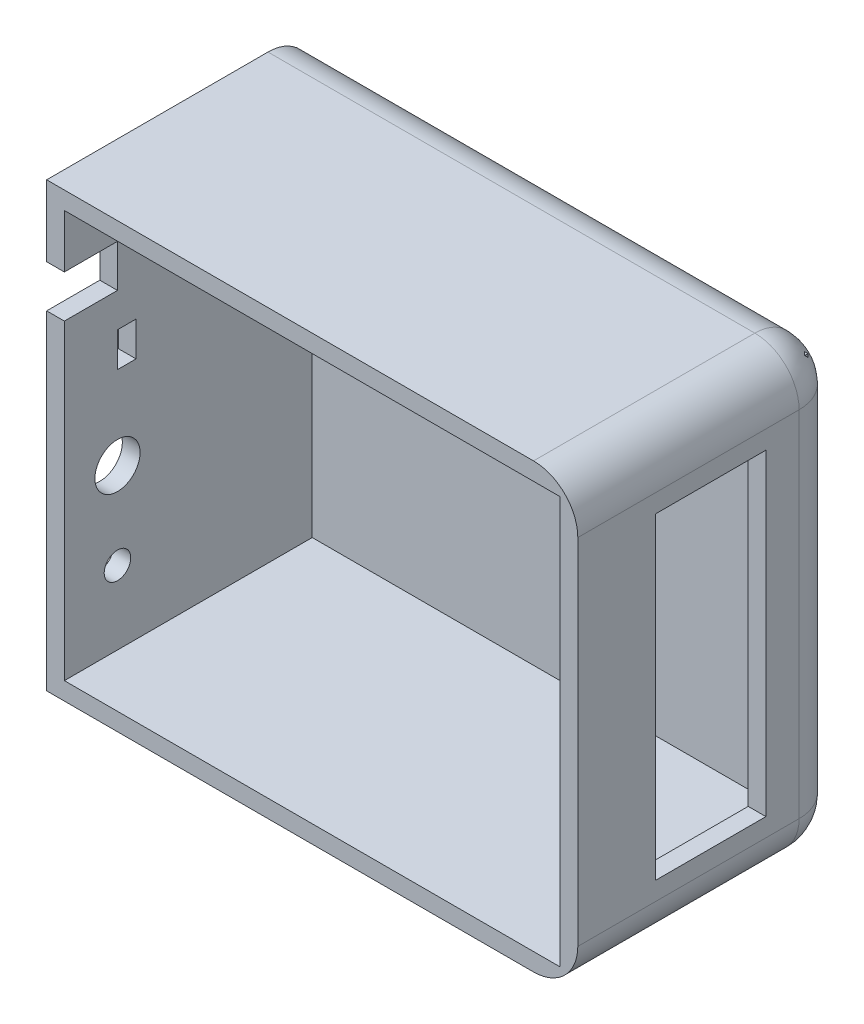
ISO-10303-21;
HEADER;
FILE_DESCRIPTION(('STEP AP214'),'2;1');
FILE_NAME('part.step','',(''),(''),'','','');
FILE_SCHEMA(('AUTOMOTIVE_DESIGN { 1 0 10303 214 1 1 1 1 }'));
ENDSEC;
DATA;
#1=APPLICATION_CONTEXT('core data for automotive mechanical design processes');
#2=APPLICATION_PROTOCOL_DEFINITION('international standard','automotive_design',2000,#1);
#3=PRODUCT_CONTEXT('',#1,'mechanical');
#4=PRODUCT('Part','Part','',(#3));
#5=PRODUCT_RELATED_PRODUCT_CATEGORY('part','',(#4));
#6=PRODUCT_DEFINITION_FORMATION('','',#4);
#7=PRODUCT_DEFINITION_CONTEXT('part definition',#1,'design');
#8=PRODUCT_DEFINITION('design','',#6,#7);
#9=PRODUCT_DEFINITION_SHAPE('','',#8);
#10=(LENGTH_UNIT() NAMED_UNIT(*) SI_UNIT(.MILLI.,.METRE.));
#11=(NAMED_UNIT(*) PLANE_ANGLE_UNIT() SI_UNIT($,.RADIAN.));
#12=(NAMED_UNIT(*) SI_UNIT($,.STERADIAN.) SOLID_ANGLE_UNIT());
#13=UNCERTAINTY_MEASURE_WITH_UNIT(LENGTH_MEASURE(1.E-05),#10,'distance_accuracy_value','');
#14=(GEOMETRIC_REPRESENTATION_CONTEXT(3) GLOBAL_UNCERTAINTY_ASSIGNED_CONTEXT((#13)) GLOBAL_UNIT_ASSIGNED_CONTEXT((#10,
#11,#12)) REPRESENTATION_CONTEXT('',''));
#15=CARTESIAN_POINT('',(0.,0.,0.));
#16=DIRECTION('',(0.,0.,1.));
#17=DIRECTION('',(1.,0.,0.));
#18=AXIS2_PLACEMENT_3D('',#15,#16,#17);
#19=CARTESIAN_POINT('',(0.,0.,4.));
#20=DIRECTION('',(1.,0.,0.));
#21=DIRECTION('',(0.,0.,-1.));
#22=AXIS2_PLACEMENT_3D('',#19,#20,#21);
#23=PLANE('',#22);
#24=CARTESIAN_POINT('',(0.,40.0941932592972,48.));
#25=DIRECTION('',(1.,0.,0.));
#26=DIRECTION('',(0.,0.,-1.));
#27=AXIS2_PLACEMENT_3D('',#24,#25,#26);
#28=CIRCLE('',#27,5.1);
#29=CARTESIAN_POINT('',(0.,40.0941932592972,42.9));
#30=VERTEX_POINT('',#29);
#31=EDGE_CURVE('E225',#30,#30,#28,.F.);
#32=ORIENTED_EDGE('',*,*,#31,.F.);
#33=EDGE_LOOP('',(#32));
#34=FACE_BOUND('',#33,.T.);
#35=DIRECTION('',(0.,1.,0.));
#36=VECTOR('',#35,1.);
#37=CARTESIAN_POINT('',(0.,0.,48.));
#38=LINE('',#37,#36);
#39=CARTESIAN_POINT('',(0.,74.357923225923,48.));
#40=VERTEX_POINT('',#39);
#41=CARTESIAN_POINT('',(0.,83.9579232259231,48.));
#42=VERTEX_POINT('',#41);
#43=EDGE_CURVE('E285',#40,#42,#38,.T.);
#44=ORIENTED_EDGE('',*,*,#43,.T.);
#45=DIRECTION('',(0.,0.,1.));
#46=VECTOR('',#45,1.);
#47=CARTESIAN_POINT('',(0.,83.9579232259231,4.));
#48=LINE('',#47,#46);
#49=CARTESIAN_POINT('',(0.,83.9579232259231,60.));
#50=VERTEX_POINT('',#49);
#51=EDGE_CURVE('E282',#42,#50,#48,.T.);
#52=ORIENTED_EDGE('',*,*,#51,.T.);
#53=DIRECTION('',(0.,-1.,0.));
#54=VECTOR('',#53,1.);
#55=CARTESIAN_POINT('',(0.,0.,60.));
#56=LINE('',#55,#54);
#57=CARTESIAN_POINT('',(0.,100.,60.));
#58=VERTEX_POINT('',#57);
#59=EDGE_CURVE('E326',#58,#50,#56,.T.);
#60=ORIENTED_EDGE('',*,*,#59,.F.);
#61=DIRECTION('',(0.,0.,-1.));
#62=VECTOR('',#61,1.);
#63=CARTESIAN_POINT('',(0.,100.,4.));
#64=LINE('',#63,#62);
#65=CARTESIAN_POINT('',(0.,100.,10.));
#66=VERTEX_POINT('',#65);
#67=EDGE_CURVE('E365',#58,#66,#64,.T.);
#68=ORIENTED_EDGE('',*,*,#67,.T.);
#69=CARTESIAN_POINT('',(0.,90.,10.));
#70=DIRECTION('',(1.,0.,0.));
#71=DIRECTION('',(0.,0.,-1.));
#72=AXIS2_PLACEMENT_3D('',#69,#70,#71);
#73=CIRCLE('',#72,10.);
#74=CARTESIAN_POINT('',(0.,90.,0.));
#75=VERTEX_POINT('',#74);
#76=EDGE_CURVE('E419',#66,#75,#73,.F.);
#77=ORIENTED_EDGE('',*,*,#76,.T.);
#78=DIRECTION('',(0.,-1.,0.));
#79=VECTOR('',#78,1.);
#80=CARTESIAN_POINT('',(0.,0.,0.));
#81=LINE('',#80,#79);
#82=CARTESIAN_POINT('',(0.,10.,0.));
#83=VERTEX_POINT('',#82);
#84=EDGE_CURVE('E363',#75,#83,#81,.T.);
#85=ORIENTED_EDGE('',*,*,#84,.T.);
#86=CARTESIAN_POINT('',(0.,10.,10.));
#87=DIRECTION('',(1.,0.,0.));
#88=DIRECTION('',(0.,0.,-1.));
#89=AXIS2_PLACEMENT_3D('',#86,#87,#88);
#90=CIRCLE('',#89,10.);
#91=CARTESIAN_POINT('',(0.,0.,10.));
#92=VERTEX_POINT('',#91);
#93=EDGE_CURVE('E401',#83,#92,#90,.F.);
#94=ORIENTED_EDGE('',*,*,#93,.T.);
#95=DIRECTION('',(0.,0.,-1.));
#96=VECTOR('',#95,1.);
#97=CARTESIAN_POINT('',(0.,0.,4.));
#98=LINE('',#97,#96);
#99=CARTESIAN_POINT('',(0.,0.,60.));
#100=VERTEX_POINT('',#99);
#101=EDGE_CURVE('E368',#100,#92,#98,.T.);
#102=ORIENTED_EDGE('',*,*,#101,.F.);
#103=CARTESIAN_POINT('',(0.,74.357923225923,60.));
#104=VERTEX_POINT('',#103);
#105=EDGE_CURVE('E325',#104,#100,#56,.T.);
#106=ORIENTED_EDGE('',*,*,#105,.F.);
#107=DIRECTION('',(0.,0.,1.));
#108=VECTOR('',#107,1.);
#109=CARTESIAN_POINT('',(0.,74.357923225923,4.));
#110=LINE('',#109,#108);
#111=EDGE_CURVE('E278',#40,#104,#110,.T.);
#112=ORIENTED_EDGE('',*,*,#111,.F.);
#113=EDGE_LOOP('',(#44,#52,#60,#68,#77,#85,#94,#102,#106,#112));
#114=FACE_BOUND('',#113,.T.);
#115=DIRECTION('',(0.,1.,0.));
#116=VECTOR('',#115,1.);
#117=CARTESIAN_POINT('',(0.,0.,48.));
#118=LINE('',#117,#116);
#119=CARTESIAN_POINT('',(0.,58.8579232259231,48.));
#120=VERTEX_POINT('',#119);
#121=CARTESIAN_POINT('',(0.,66.6579232259231,48.));
#122=VERTEX_POINT('',#121);
#123=EDGE_CURVE('E262',#120,#122,#118,.T.);
#124=ORIENTED_EDGE('',*,*,#123,.F.);
#125=DIRECTION('',(0.,0.,1.));
#126=VECTOR('',#125,1.);
#127=CARTESIAN_POINT('',(0.,58.8579232259231,4.));
#128=LINE('',#127,#126);
#129=CARTESIAN_POINT('',(0.,58.8579232259231,43.8));
#130=VERTEX_POINT('',#129);
#131=EDGE_CURVE('E248',#130,#120,#128,.T.);
#132=ORIENTED_EDGE('',*,*,#131,.F.);
#133=DIRECTION('',(0.,1.,0.));
#134=VECTOR('',#133,1.);
#135=CARTESIAN_POINT('',(0.,0.,43.8));
#136=LINE('',#135,#134);
#137=CARTESIAN_POINT('',(0.,66.6579232259231,43.8));
#138=VERTEX_POINT('',#137);
#139=EDGE_CURVE('E216',#130,#138,#136,.T.);
#140=ORIENTED_EDGE('',*,*,#139,.T.);
#141=DIRECTION('',(0.,0.,1.));
#142=VECTOR('',#141,1.);
#143=CARTESIAN_POINT('',(0.,66.6579232259231,4.));
#144=LINE('',#143,#142);
#145=EDGE_CURVE('E214',#138,#122,#144,.T.);
#146=ORIENTED_EDGE('',*,*,#145,.T.);
#147=EDGE_LOOP('',(#124,#132,#140,#146));
#148=FACE_BOUND('',#147,.T.);
#149=CARTESIAN_POINT('',(0.,20.5603193344936,48.));
#150=DIRECTION('',(1.,0.,0.));
#151=DIRECTION('',(0.,0.,-1.));
#152=AXIS2_PLACEMENT_3D('',#149,#150,#151);
#153=CIRCLE('',#152,3.);
#154=CARTESIAN_POINT('',(0.,20.5603193344936,45.));
#155=VERTEX_POINT('',#154);
#156=EDGE_CURVE('E226',#155,#155,#153,.F.);
#157=ORIENTED_EDGE('',*,*,#156,.F.);
#158=EDGE_LOOP('',(#157));
#159=FACE_BOUND('',#158,.T.);
#160=ADVANCED_FACE('F41',(#34,#114,#148,#159),#23,.F.);
#161=CARTESIAN_POINT('',(4.00000000000001,0.,60.));
#162=DIRECTION('',(1.,0.,0.));
#163=DIRECTION('',(0.,1.,0.));
#164=AXIS2_PLACEMENT_3D('',#161,#162,#163);
#165=PLANE('',#164);
#166=CARTESIAN_POINT('',(4.00000000000001,40.0941932592972,48.));
#167=DIRECTION('',(1.,0.,0.));
#168=DIRECTION('',(0.,1.,0.));
#169=AXIS2_PLACEMENT_3D('',#166,#167,#168);
#170=CIRCLE('',#169,5.1);
#171=CARTESIAN_POINT('',(4.00000000000001,45.1941932592972,48.));
#172=VERTEX_POINT('',#171);
#173=EDGE_CURVE('E223',#172,#172,#170,.F.);
#174=ORIENTED_EDGE('',*,*,#173,.T.);
#175=EDGE_LOOP('',(#174));
#176=FACE_BOUND('',#175,.T.);
#177=DIRECTION('',(0.,0.,1.));
#178=VECTOR('',#177,1.);
#179=CARTESIAN_POINT('',(4.,83.9579232259231,60.));
#180=LINE('',#179,#178);
#181=CARTESIAN_POINT('',(4.,83.9579232259231,48.));
#182=VERTEX_POINT('',#181);
#183=CARTESIAN_POINT('',(4.00000000000001,83.9579232259231,60.));
#184=VERTEX_POINT('',#183);
#185=EDGE_CURVE('E279',#182,#184,#180,.T.);
#186=ORIENTED_EDGE('',*,*,#185,.F.);
#187=DIRECTION('',(0.,1.,0.));
#188=VECTOR('',#187,1.);
#189=CARTESIAN_POINT('',(4.00000000000001,0.,48.));
#190=LINE('',#189,#188);
#191=CARTESIAN_POINT('',(4.,74.357923225923,48.));
#192=VERTEX_POINT('',#191);
#193=EDGE_CURVE('E207',#192,#182,#190,.T.);
#194=ORIENTED_EDGE('',*,*,#193,.F.);
#195=DIRECTION('',(0.,0.,1.));
#196=VECTOR('',#195,1.);
#197=CARTESIAN_POINT('',(4.,74.357923225923,60.));
#198=LINE('',#197,#196);
#199=CARTESIAN_POINT('',(4.00000000000001,74.357923225923,60.));
#200=VERTEX_POINT('',#199);
#201=EDGE_CURVE('E275',#192,#200,#198,.T.);
#202=ORIENTED_EDGE('',*,*,#201,.T.);
#203=DIRECTION('',(0.,-1.,0.));
#204=VECTOR('',#203,1.);
#205=CARTESIAN_POINT('',(4.00000000000001,0.,60.));
#206=LINE('',#205,#204);
#207=CARTESIAN_POINT('',(4.00000000000001,3.99999999999999,60.));
#208=VERTEX_POINT('',#207);
#209=EDGE_CURVE('E329',#200,#208,#206,.T.);
#210=ORIENTED_EDGE('',*,*,#209,.T.);
#211=DIRECTION('',(0.,0.,-1.));
#212=VECTOR('',#211,1.);
#213=CARTESIAN_POINT('',(4.00000000000001,3.99999999999999,60.));
#214=LINE('',#213,#212);
#215=CARTESIAN_POINT('',(4.00000000000001,3.99999999999999,4.));
#216=VERTEX_POINT('',#215);
#217=EDGE_CURVE('E341',#208,#216,#214,.T.);
#218=ORIENTED_EDGE('',*,*,#217,.T.);
#219=DIRECTION('',(0.,-1.,0.));
#220=VECTOR('',#219,1.);
#221=CARTESIAN_POINT('',(4.00000000000001,0.,4.));
#222=LINE('',#221,#220);
#223=CARTESIAN_POINT('',(4.,96.,4.));
#224=VERTEX_POINT('',#223);
#225=EDGE_CURVE('E360',#224,#216,#222,.T.);
#226=ORIENTED_EDGE('',*,*,#225,.F.);
#227=DIRECTION('',(0.,0.,-1.));
#228=VECTOR('',#227,1.);
#229=CARTESIAN_POINT('',(4.,96.,60.));
#230=LINE('',#229,#228);
#231=CARTESIAN_POINT('',(4.,96.,60.));
#232=VERTEX_POINT('',#231);
#233=EDGE_CURVE('E349',#232,#224,#230,.T.);
#234=ORIENTED_EDGE('',*,*,#233,.F.);
#235=EDGE_CURVE('E330',#232,#184,#206,.T.);
#236=ORIENTED_EDGE('',*,*,#235,.T.);
#237=EDGE_LOOP('',(#186,#194,#202,#210,#218,#226,#234,#236));
#238=FACE_BOUND('',#237,.T.);
#239=DIRECTION('',(0.,0.,1.));
#240=VECTOR('',#239,1.);
#241=CARTESIAN_POINT('',(4.00000000000001,58.8579232259231,60.));
#242=LINE('',#241,#240);
#243=CARTESIAN_POINT('',(4.00000000000001,58.8579232259231,43.8));
#244=VERTEX_POINT('',#243);
#245=CARTESIAN_POINT('',(4.00000000000001,58.8579232259231,48.));
#246=VERTEX_POINT('',#245);
#247=EDGE_CURVE('E50',#244,#246,#242,.T.);
#248=ORIENTED_EDGE('',*,*,#247,.T.);
#249=DIRECTION('',(0.,1.,0.));
#250=VECTOR('',#249,1.);
#251=CARTESIAN_POINT('',(4.00000000000001,0.,48.));
#252=LINE('',#251,#250);
#253=CARTESIAN_POINT('',(4.,66.6579232259231,48.));
#254=VERTEX_POINT('',#253);
#255=EDGE_CURVE('E12',#246,#254,#252,.T.);
#256=ORIENTED_EDGE('',*,*,#255,.T.);
#257=DIRECTION('',(0.,0.,1.));
#258=VECTOR('',#257,1.);
#259=CARTESIAN_POINT('',(4.,66.6579232259231,60.));
#260=LINE('',#259,#258);
#261=CARTESIAN_POINT('',(4.,66.6579232259231,43.8));
#262=VERTEX_POINT('',#261);
#263=EDGE_CURVE('E206',#262,#254,#260,.T.);
#264=ORIENTED_EDGE('',*,*,#263,.F.);
#265=DIRECTION('',(0.,1.,0.));
#266=VECTOR('',#265,1.);
#267=CARTESIAN_POINT('',(4.00000000000001,0.,43.8));
#268=LINE('',#267,#266);
#269=EDGE_CURVE('E201',#244,#262,#268,.T.);
#270=ORIENTED_EDGE('',*,*,#269,.F.);
#271=EDGE_LOOP('',(#248,#256,#264,#270));
#272=FACE_BOUND('',#271,.T.);
#273=CARTESIAN_POINT('',(4.00000000000001,20.5603193344936,48.));
#274=DIRECTION('',(1.,0.,0.));
#275=DIRECTION('',(0.,1.,0.));
#276=AXIS2_PLACEMENT_3D('',#273,#274,#275);
#277=CIRCLE('',#276,3.);
#278=CARTESIAN_POINT('',(4.00000000000001,23.5603193344936,48.));
#279=VERTEX_POINT('',#278);
#280=EDGE_CURVE('E45',#279,#279,#277,.F.);
#281=ORIENTED_EDGE('',*,*,#280,.T.);
#282=EDGE_LOOP('',(#281));
#283=FACE_BOUND('',#282,.T.);
#284=ADVANCED_FACE('F218',(#176,#238,#272,#283),#165,.T.);
#285=CARTESIAN_POINT('',(120.,0.,4.));
#286=DIRECTION('',(-1.,0.,0.));
#287=DIRECTION('',(0.,0.,1.));
#288=AXIS2_PLACEMENT_3D('',#285,#286,#287);
#289=PLANE('',#288);
#290=DIRECTION('',(0.,1.,0.));
#291=VECTOR('',#290,1.);
#292=CARTESIAN_POINT('',(120.,100.,10.));
#293=LINE('',#292,#291);
#294=CARTESIAN_POINT('',(120.,9.99999999999999,10.));
#295=VERTEX_POINT('',#294);
#296=CARTESIAN_POINT('',(120.,90.,10.));
#297=VERTEX_POINT('',#296);
#298=EDGE_CURVE('E380',#295,#297,#293,.T.);
#299=ORIENTED_EDGE('',*,*,#298,.T.);
#300=DIRECTION('',(0.,0.,-1.));
#301=VECTOR('',#300,1.);
#302=CARTESIAN_POINT('',(120.,90.,4.));
#303=LINE('',#302,#301);
#304=CARTESIAN_POINT('',(120.,90.,60.));
#305=VERTEX_POINT('',#304);
#306=EDGE_CURVE('E413',#297,#305,#303,.F.);
#307=ORIENTED_EDGE('',*,*,#306,.T.);
#308=DIRECTION('',(0.,-1.,0.));
#309=VECTOR('',#308,1.);
#310=CARTESIAN_POINT('',(120.,0.,60.));
#311=LINE('',#310,#309);
#312=CARTESIAN_POINT('',(120.,10.,60.));
#313=VERTEX_POINT('',#312);
#314=EDGE_CURVE('E320',#305,#313,#311,.T.);
#315=ORIENTED_EDGE('',*,*,#314,.T.);
#316=DIRECTION('',(0.,0.,-1.));
#317=VECTOR('',#316,1.);
#318=CARTESIAN_POINT('',(120.,10.,4.));
#319=LINE('',#318,#317);
#320=EDGE_CURVE('E385',#313,#295,#319,.T.);
#321=ORIENTED_EDGE('',*,*,#320,.T.);
#322=EDGE_LOOP('',(#299,#307,#315,#321));
#323=FACE_BOUND('',#322,.T.);
#324=DIRECTION('',(0.,0.,-1.));
#325=VECTOR('',#324,1.);
#326=CARTESIAN_POINT('',(120.,14.15,4.));
#327=LINE('',#326,#325);
#328=CARTESIAN_POINT('',(120.,14.15,42.5));
#329=VERTEX_POINT('',#328);
#330=CARTESIAN_POINT('',(120.,14.15,17.5));
#331=VERTEX_POINT('',#330);
#332=EDGE_CURVE('E315',#329,#331,#327,.T.);
#333=ORIENTED_EDGE('',*,*,#332,.F.);
#334=DIRECTION('',(0.,-1.,0.));
#335=VECTOR('',#334,1.);
#336=CARTESIAN_POINT('',(120.,0.,42.5));
#337=LINE('',#336,#335);
#338=CARTESIAN_POINT('',(120.,85.85,42.5));
#339=VERTEX_POINT('',#338);
#340=EDGE_CURVE('E302',#339,#329,#337,.T.);
#341=ORIENTED_EDGE('',*,*,#340,.F.);
#342=DIRECTION('',(0.,0.,1.));
#343=VECTOR('',#342,1.);
#344=CARTESIAN_POINT('',(120.,85.85,4.));
#345=LINE('',#344,#343);
#346=CARTESIAN_POINT('',(120.,85.85,17.5));
#347=VERTEX_POINT('',#346);
#348=EDGE_CURVE('E304',#347,#339,#345,.T.);
#349=ORIENTED_EDGE('',*,*,#348,.F.);
#350=DIRECTION('',(0.,1.,0.));
#351=VECTOR('',#350,1.);
#352=CARTESIAN_POINT('',(120.,0.,17.5));
#353=LINE('',#352,#351);
#354=EDGE_CURVE('E313',#331,#347,#353,.T.);
#355=ORIENTED_EDGE('',*,*,#354,.F.);
#356=EDGE_LOOP('',(#333,#341,#349,#355));
#357=FACE_BOUND('',#356,.T.);
#358=ADVANCED_FACE('F469',(#323,#357),#289,.F.);
#359=CARTESIAN_POINT('',(116.,0.,60.));
#360=DIRECTION('',(1.,0.,0.));
#361=DIRECTION('',(0.,1.,0.));
#362=AXIS2_PLACEMENT_3D('',#359,#360,#361);
#363=PLANE('',#362);
#364=DIRECTION('',(0.,0.,-1.));
#365=VECTOR('',#364,1.);
#366=CARTESIAN_POINT('',(116.,96.,60.));
#367=LINE('',#366,#365);
#368=CARTESIAN_POINT('',(116.,96.,60.));
#369=VERTEX_POINT('',#368);
#370=CARTESIAN_POINT('',(116.,96.,4.));
#371=VERTEX_POINT('',#370);
#372=EDGE_CURVE('E346',#369,#371,#367,.T.);
#373=ORIENTED_EDGE('',*,*,#372,.T.);
#374=DIRECTION('',(0.,-1.,0.));
#375=VECTOR('',#374,1.);
#376=CARTESIAN_POINT('',(116.,0.,4.));
#377=LINE('',#376,#375);
#378=CARTESIAN_POINT('',(116.,3.99999999999999,4.));
#379=VERTEX_POINT('',#378);
#380=EDGE_CURVE('E355',#371,#379,#377,.T.);
#381=ORIENTED_EDGE('',*,*,#380,.T.);
#382=DIRECTION('',(0.,0.,-1.));
#383=VECTOR('',#382,1.);
#384=CARTESIAN_POINT('',(116.,3.99999999999999,60.));
#385=LINE('',#384,#383);
#386=CARTESIAN_POINT('',(116.,3.99999999999999,60.));
#387=VERTEX_POINT('',#386);
#388=EDGE_CURVE('E344',#387,#379,#385,.T.);
#389=ORIENTED_EDGE('',*,*,#388,.F.);
#390=DIRECTION('',(0.,-1.,0.));
#391=VECTOR('',#390,1.);
#392=CARTESIAN_POINT('',(116.,0.,60.));
#393=LINE('',#392,#391);
#394=EDGE_CURVE('E336',#369,#387,#393,.T.);
#395=ORIENTED_EDGE('',*,*,#394,.F.);
#396=EDGE_LOOP('',(#373,#381,#389,#395));
#397=FACE_BOUND('',#396,.T.);
#398=DIRECTION('',(0.,0.,1.));
#399=VECTOR('',#398,1.);
#400=CARTESIAN_POINT('',(116.,14.15,60.));
#401=LINE('',#400,#399);
#402=CARTESIAN_POINT('',(116.,14.15,17.5));
#403=VERTEX_POINT('',#402);
#404=CARTESIAN_POINT('',(116.,14.15,42.5));
#405=VERTEX_POINT('',#404);
#406=EDGE_CURVE('E377',#403,#405,#401,.T.);
#407=ORIENTED_EDGE('',*,*,#406,.F.);
#408=DIRECTION('',(0.,-1.,0.));
#409=VECTOR('',#408,1.);
#410=CARTESIAN_POINT('',(116.,0.,17.5));
#411=LINE('',#410,#409);
#412=CARTESIAN_POINT('',(116.,85.85,17.5));
#413=VERTEX_POINT('',#412);
#414=EDGE_CURVE('E375',#413,#403,#411,.T.);
#415=ORIENTED_EDGE('',*,*,#414,.F.);
#416=DIRECTION('',(0.,0.,-1.));
#417=VECTOR('',#416,1.);
#418=CARTESIAN_POINT('',(116.,85.85,60.));
#419=LINE('',#418,#417);
#420=CARTESIAN_POINT('',(116.,85.85,42.5));
#421=VERTEX_POINT('',#420);
#422=EDGE_CURVE('E373',#421,#413,#419,.T.);
#423=ORIENTED_EDGE('',*,*,#422,.F.);
#424=DIRECTION('',(0.,1.,0.));
#425=VECTOR('',#424,1.);
#426=CARTESIAN_POINT('',(116.,0.,42.5));
#427=LINE('',#426,#425);
#428=EDGE_CURVE('E371',#405,#421,#427,.T.);
#429=ORIENTED_EDGE('',*,*,#428,.F.);
#430=EDGE_LOOP('',(#407,#415,#423,#429));
#431=FACE_BOUND('',#430,.T.);
#432=ADVANCED_FACE('F465',(#397,#431),#363,.F.);
#433=CARTESIAN_POINT('',(0.,0.,4.));
#434=DIRECTION('',(0.,1.,0.));
#435=DIRECTION('',(0.,0.,1.));
#436=AXIS2_PLACEMENT_3D('',#433,#434,#435);
#437=PLANE('',#436);
#438=DIRECTION('',(1.,0.,0.));
#439=VECTOR('',#438,1.);
#440=CARTESIAN_POINT('',(110.,0.,10.));
#441=LINE('',#440,#439);
#442=CARTESIAN_POINT('',(110.,0.,10.));
#443=VERTEX_POINT('',#442);
#444=EDGE_CURVE('E388',#92,#443,#441,.T.);
#445=ORIENTED_EDGE('',*,*,#444,.T.);
#446=DIRECTION('',(0.,0.,-1.));
#447=VECTOR('',#446,1.);
#448=CARTESIAN_POINT('',(110.,0.,4.));
#449=LINE('',#448,#447);
#450=CARTESIAN_POINT('',(110.,0.,60.));
#451=VERTEX_POINT('',#450);
#452=EDGE_CURVE('E390',#443,#451,#449,.F.);
#453=ORIENTED_EDGE('',*,*,#452,.T.);
#454=DIRECTION('',(1.,0.,0.));
#455=VECTOR('',#454,1.);
#456=CARTESIAN_POINT('',(0.,0.,60.));
#457=LINE('',#456,#455);
#458=EDGE_CURVE('E317',#100,#451,#457,.T.);
#459=ORIENTED_EDGE('',*,*,#458,.F.);
#460=ORIENTED_EDGE('',*,*,#101,.T.);
#461=EDGE_LOOP('',(#445,#453,#459,#460));
#462=FACE_BOUND('',#461,.T.);
#463=ADVANCED_FACE('F468',(#462),#437,.F.);
#464=CARTESIAN_POINT('',(0.,100.,4.));
#465=DIRECTION('',(0.,-1.,0.));
#466=DIRECTION('',(0.,0.,-1.));
#467=AXIS2_PLACEMENT_3D('',#464,#465,#466);
#468=PLANE('',#467);
#469=DIRECTION('',(1.,0.,0.));
#470=VECTOR('',#469,1.);
#471=CARTESIAN_POINT('',(0.,100.,60.));
#472=LINE('',#471,#470);
#473=CARTESIAN_POINT('',(110.,100.,60.));
#474=VERTEX_POINT('',#473);
#475=EDGE_CURVE('E322',#58,#474,#472,.T.);
#476=ORIENTED_EDGE('',*,*,#475,.T.);
#477=DIRECTION('',(0.,0.,-1.));
#478=VECTOR('',#477,1.);
#479=CARTESIAN_POINT('',(110.,100.,4.));
#480=LINE('',#479,#478);
#481=CARTESIAN_POINT('',(110.,100.,10.));
#482=VERTEX_POINT('',#481);
#483=EDGE_CURVE('E410',#474,#482,#480,.T.);
#484=ORIENTED_EDGE('',*,*,#483,.T.);
#485=DIRECTION('',(-1.,0.,0.));
#486=VECTOR('',#485,1.);
#487=CARTESIAN_POINT('',(0.,100.,10.));
#488=LINE('',#487,#486);
#489=EDGE_CURVE('E403',#482,#66,#488,.T.);
#490=ORIENTED_EDGE('',*,*,#489,.T.);
#491=ORIENTED_EDGE('',*,*,#67,.F.);
#492=EDGE_LOOP('',(#476,#484,#490,#491));
#493=FACE_BOUND('',#492,.T.);
#494=ADVANCED_FACE('F549',(#493),#468,.F.);
#495=CARTESIAN_POINT('',(0.,0.,0.));
#496=DIRECTION('',(0.,0.,-1.));
#497=DIRECTION('',(-1.,0.,0.));
#498=AXIS2_PLACEMENT_3D('',#495,#496,#497);
#499=PLANE('',#498);
#500=ORIENTED_EDGE('',*,*,#84,.F.);
#501=DIRECTION('',(-1.,0.,0.));
#502=VECTOR('',#501,1.);
#503=CARTESIAN_POINT('',(110.,90.,0.));
#504=LINE('',#503,#502);
#505=CARTESIAN_POINT('',(110.,90.,0.));
#506=VERTEX_POINT('',#505);
#507=EDGE_CURVE('E421',#75,#506,#504,.F.);
#508=ORIENTED_EDGE('',*,*,#507,.T.);
#509=DIRECTION('',(0.,1.,0.));
#510=VECTOR('',#509,1.);
#511=CARTESIAN_POINT('',(110.,0.,0.));
#512=LINE('',#511,#510);
#513=CARTESIAN_POINT('',(110.,10.,0.));
#514=VERTEX_POINT('',#513);
#515=EDGE_CURVE('E383',#506,#514,#512,.F.);
#516=ORIENTED_EDGE('',*,*,#515,.T.);
#517=DIRECTION('',(1.,0.,0.));
#518=VECTOR('',#517,1.);
#519=CARTESIAN_POINT('',(0.,10.,0.));
#520=LINE('',#519,#518);
#521=EDGE_CURVE('E398',#514,#83,#520,.F.);
#522=ORIENTED_EDGE('',*,*,#521,.T.);
#523=EDGE_LOOP('',(#500,#508,#516,#522));
#524=FACE_BOUND('',#523,.T.);
#525=ADVANCED_FACE('F554',(#524),#499,.T.);
#526=CARTESIAN_POINT('',(0.,96.,60.));
#527=DIRECTION('',(0.,1.,0.));
#528=DIRECTION('',(0.,0.,1.));
#529=AXIS2_PLACEMENT_3D('',#526,#527,#528);
#530=PLANE('',#529);
#531=ORIENTED_EDGE('',*,*,#233,.T.);
#532=DIRECTION('',(1.,0.,0.));
#533=VECTOR('',#532,1.);
#534=CARTESIAN_POINT('',(0.,96.,4.));
#535=LINE('',#534,#533);
#536=EDGE_CURVE('E358',#224,#371,#535,.T.);
#537=ORIENTED_EDGE('',*,*,#536,.T.);
#538=ORIENTED_EDGE('',*,*,#372,.F.);
#539=DIRECTION('',(1.,0.,0.));
#540=VECTOR('',#539,1.);
#541=CARTESIAN_POINT('',(0.,96.,60.));
#542=LINE('',#541,#540);
#543=EDGE_CURVE('E333',#232,#369,#542,.T.);
#544=ORIENTED_EDGE('',*,*,#543,.F.);
#545=EDGE_LOOP('',(#531,#537,#538,#544));
#546=FACE_BOUND('',#545,.T.);
#547=ADVANCED_FACE('F463',(#546),#530,.F.);
#548=CARTESIAN_POINT('',(0.,3.99999999999999,60.));
#549=DIRECTION('',(0.,1.,0.));
#550=DIRECTION('',(0.,0.,1.));
#551=AXIS2_PLACEMENT_3D('',#548,#549,#550);
#552=PLANE('',#551);
#553=DIRECTION('',(1.,0.,0.));
#554=VECTOR('',#553,1.);
#555=CARTESIAN_POINT('',(0.,3.99999999999999,4.));
#556=LINE('',#555,#554);
#557=EDGE_CURVE('E352',#216,#379,#556,.T.);
#558=ORIENTED_EDGE('',*,*,#557,.F.);
#559=ORIENTED_EDGE('',*,*,#217,.F.);
#560=DIRECTION('',(1.,0.,0.));
#561=VECTOR('',#560,1.);
#562=CARTESIAN_POINT('',(0.,3.99999999999999,60.));
#563=LINE('',#562,#561);
#564=EDGE_CURVE('E338',#208,#387,#563,.T.);
#565=ORIENTED_EDGE('',*,*,#564,.T.);
#566=ORIENTED_EDGE('',*,*,#388,.T.);
#567=EDGE_LOOP('',(#558,#559,#565,#566));
#568=FACE_BOUND('',#567,.T.);
#569=ADVANCED_FACE('F457',(#568),#552,.T.);
#570=CARTESIAN_POINT('',(0.,0.,60.));
#571=DIRECTION('',(0.,0.,1.));
#572=DIRECTION('',(1.,0.,0.));
#573=AXIS2_PLACEMENT_3D('',#570,#571,#572);
#574=PLANE('',#573);
#575=DIRECTION('',(-1.,0.,0.));
#576=VECTOR('',#575,1.);
#577=CARTESIAN_POINT('',(0.,83.9579232259231,60.));
#578=LINE('',#577,#576);
#579=EDGE_CURVE('E429',#184,#50,#578,.T.);
#580=ORIENTED_EDGE('',*,*,#579,.F.);
#581=ORIENTED_EDGE('',*,*,#235,.F.);
#582=ORIENTED_EDGE('',*,*,#543,.T.);
#583=ORIENTED_EDGE('',*,*,#394,.T.);
#584=ORIENTED_EDGE('',*,*,#564,.F.);
#585=ORIENTED_EDGE('',*,*,#209,.F.);
#586=DIRECTION('',(-1.,0.,0.));
#587=VECTOR('',#586,1.);
#588=CARTESIAN_POINT('',(0.,74.357923225923,60.));
#589=LINE('',#588,#587);
#590=EDGE_CURVE('E423',#200,#104,#589,.T.);
#591=ORIENTED_EDGE('',*,*,#590,.T.);
#592=ORIENTED_EDGE('',*,*,#105,.T.);
#593=ORIENTED_EDGE('',*,*,#458,.T.);
#594=CARTESIAN_POINT('',(110.,10.,60.));
#595=DIRECTION('',(0.,0.,1.));
#596=DIRECTION('',(1.,0.,0.));
#597=AXIS2_PLACEMENT_3D('',#594,#595,#596);
#598=CIRCLE('',#597,10.);
#599=EDGE_CURVE('E392',#451,#313,#598,.T.);
#600=ORIENTED_EDGE('',*,*,#599,.T.);
#601=ORIENTED_EDGE('',*,*,#314,.F.);
#602=CARTESIAN_POINT('',(110.,90.,60.));
#603=DIRECTION('',(0.,0.,1.));
#604=DIRECTION('',(1.,0.,0.));
#605=AXIS2_PLACEMENT_3D('',#602,#603,#604);
#606=CIRCLE('',#605,10.);
#607=EDGE_CURVE('E415',#305,#474,#606,.T.);
#608=ORIENTED_EDGE('',*,*,#607,.T.);
#609=ORIENTED_EDGE('',*,*,#475,.F.);
#610=ORIENTED_EDGE('',*,*,#59,.T.);
#611=EDGE_LOOP('',(#580,#581,#582,#583,#584,#585,#591,#592,#593,#600,#601,#608,#609,#610));
#612=FACE_BOUND('',#611,.T.);
#613=ADVANCED_FACE('F443',(#612),#574,.T.);
#614=CARTESIAN_POINT('',(0.,0.,4.));
#615=DIRECTION('',(0.,0.,-1.));
#616=DIRECTION('',(-1.,0.,0.));
#617=AXIS2_PLACEMENT_3D('',#614,#615,#616);
#618=PLANE('',#617);
#619=ORIENTED_EDGE('',*,*,#536,.F.);
#620=ORIENTED_EDGE('',*,*,#225,.T.);
#621=ORIENTED_EDGE('',*,*,#557,.T.);
#622=ORIENTED_EDGE('',*,*,#380,.F.);
#623=EDGE_LOOP('',(#619,#620,#621,#622));
#624=FACE_BOUND('',#623,.T.);
#625=ADVANCED_FACE('F460',(#624),#618,.F.);
#626=CARTESIAN_POINT('',(120.,14.15,17.5));
#627=DIRECTION('',(0.,1.,0.));
#628=DIRECTION('',(0.,0.,1.));
#629=AXIS2_PLACEMENT_3D('',#626,#627,#628);
#630=PLANE('',#629);
#631=ORIENTED_EDGE('',*,*,#332,.T.);
#632=DIRECTION('',(1.,0.,0.));
#633=VECTOR('',#632,1.);
#634=CARTESIAN_POINT('',(120.,14.15,17.5));
#635=LINE('',#634,#633);
#636=EDGE_CURVE('E299',#403,#331,#635,.T.);
#637=ORIENTED_EDGE('',*,*,#636,.F.);
#638=ORIENTED_EDGE('',*,*,#406,.T.);
#639=DIRECTION('',(1.,0.,0.));
#640=VECTOR('',#639,1.);
#641=CARTESIAN_POINT('',(120.,14.15,42.5));
#642=LINE('',#641,#640);
#643=EDGE_CURVE('E294',#405,#329,#642,.T.);
#644=ORIENTED_EDGE('',*,*,#643,.T.);
#645=EDGE_LOOP('',(#631,#637,#638,#644));
#646=FACE_BOUND('',#645,.T.);
#647=ADVANCED_FACE('F477',(#646),#630,.T.);
#648=CARTESIAN_POINT('',(120.,14.15,17.5));
#649=DIRECTION('',(0.,0.,1.));
#650=DIRECTION('',(1.,0.,0.));
#651=AXIS2_PLACEMENT_3D('',#648,#649,#650);
#652=PLANE('',#651);
#653=ORIENTED_EDGE('',*,*,#354,.T.);
#654=DIRECTION('',(1.,0.,0.));
#655=VECTOR('',#654,1.);
#656=CARTESIAN_POINT('',(120.,85.85,17.5));
#657=LINE('',#656,#655);
#658=EDGE_CURVE('E298',#413,#347,#657,.T.);
#659=ORIENTED_EDGE('',*,*,#658,.F.);
#660=ORIENTED_EDGE('',*,*,#414,.T.);
#661=ORIENTED_EDGE('',*,*,#636,.T.);
#662=EDGE_LOOP('',(#653,#659,#660,#661));
#663=FACE_BOUND('',#662,.T.);
#664=ADVANCED_FACE('F481',(#663),#652,.T.);
#665=CARTESIAN_POINT('',(120.,85.85,17.5));
#666=DIRECTION('',(0.,-1.,0.));
#667=DIRECTION('',(0.,0.,-1.));
#668=AXIS2_PLACEMENT_3D('',#665,#666,#667);
#669=PLANE('',#668);
#670=ORIENTED_EDGE('',*,*,#348,.T.);
#671=DIRECTION('',(1.,0.,0.));
#672=VECTOR('',#671,1.);
#673=CARTESIAN_POINT('',(120.,85.85,42.5));
#674=LINE('',#673,#672);
#675=EDGE_CURVE('E300',#421,#339,#674,.T.);
#676=ORIENTED_EDGE('',*,*,#675,.F.);
#677=ORIENTED_EDGE('',*,*,#422,.T.);
#678=ORIENTED_EDGE('',*,*,#658,.T.);
#679=EDGE_LOOP('',(#670,#676,#677,#678));
#680=FACE_BOUND('',#679,.T.);
#681=ADVANCED_FACE('F489',(#680),#669,.T.);
#682=CARTESIAN_POINT('',(120.,14.15,42.5));
#683=DIRECTION('',(0.,0.,-1.));
#684=DIRECTION('',(-1.,0.,0.));
#685=AXIS2_PLACEMENT_3D('',#682,#683,#684);
#686=PLANE('',#685);
#687=ORIENTED_EDGE('',*,*,#340,.T.);
#688=ORIENTED_EDGE('',*,*,#643,.F.);
#689=ORIENTED_EDGE('',*,*,#428,.T.);
#690=ORIENTED_EDGE('',*,*,#675,.T.);
#691=EDGE_LOOP('',(#687,#688,#689,#690));
#692=FACE_BOUND('',#691,.T.);
#693=ADVANCED_FACE('F491',(#692),#686,.T.);
#694=CARTESIAN_POINT('',(110.,0.,10.));
#695=DIRECTION('',(0.,-1.,0.));
#696=DIRECTION('',(0.,0.,-1.));
#697=AXIS2_PLACEMENT_3D('',#694,#695,#696);
#698=CYLINDRICAL_SURFACE('',#697,10.);
#699=ORIENTED_EDGE('',*,*,#515,.F.);
#700=CARTESIAN_POINT('',(110.,90.,10.));
#701=DIRECTION('',(0.,-1.,0.));
#702=DIRECTION('',(0.,0.,-1.));
#703=AXIS2_PLACEMENT_3D('',#700,#701,#702);
#704=CIRCLE('',#703,10.);
#705=EDGE_CURVE('E417',#506,#297,#704,.T.);
#706=ORIENTED_EDGE('',*,*,#705,.T.);
#707=ORIENTED_EDGE('',*,*,#298,.F.);
#708=CARTESIAN_POINT('',(110.,10.,10.));
#709=DIRECTION('',(0.,-1.,0.));
#710=DIRECTION('',(0.,0.,-1.));
#711=AXIS2_PLACEMENT_3D('',#708,#709,#710);
#712=CIRCLE('',#711,10.);
#713=EDGE_CURVE('E395',#295,#514,#712,.F.);
#714=ORIENTED_EDGE('',*,*,#713,.T.);
#715=EDGE_LOOP('',(#699,#706,#707,#714));
#716=FACE_BOUND('',#715,.T.);
#717=ADVANCED_FACE('F493',(#716),#698,.T.);
#718=CARTESIAN_POINT('',(0.,10.,10.));
#719=DIRECTION('',(-1.,0.,0.));
#720=DIRECTION('',(0.,0.,1.));
#721=AXIS2_PLACEMENT_3D('',#718,#719,#720);
#722=CYLINDRICAL_SURFACE('',#721,10.);
#723=ORIENTED_EDGE('',*,*,#93,.F.);
#724=ORIENTED_EDGE('',*,*,#521,.F.);
#725=CARTESIAN_POINT('',(110.,10.,10.));
#726=DIRECTION('',(1.,0.,0.));
#727=DIRECTION('',(0.,0.,-1.));
#728=AXIS2_PLACEMENT_3D('',#725,#726,#727);
#729=CIRCLE('',#728,10.);
#730=EDGE_CURVE('E312',#443,#514,#729,.T.);
#731=ORIENTED_EDGE('',*,*,#730,.F.);
#732=ORIENTED_EDGE('',*,*,#444,.F.);
#733=EDGE_LOOP('',(#723,#724,#731,#732));
#734=FACE_BOUND('',#733,.T.);
#735=ADVANCED_FACE('F499',(#734),#722,.T.);
#736=CARTESIAN_POINT('',(110.,10.,10.));
#737=DIRECTION('',(0.,0.,1.));
#738=DIRECTION('',(1.,0.,0.));
#739=AXIS2_PLACEMENT_3D('',#736,#737,#738);
#740=SPHERICAL_SURFACE('',#739,10.);
#741=ORIENTED_EDGE('',*,*,#730,.T.);
#742=ORIENTED_EDGE('',*,*,#713,.F.);
#743=CARTESIAN_POINT('',(110.,10.,10.));
#744=DIRECTION('',(0.,0.,1.));
#745=DIRECTION('',(1.,0.,0.));
#746=AXIS2_PLACEMENT_3D('',#743,#744,#745);
#747=CIRCLE('',#746,10.);
#748=EDGE_CURVE('E404',#443,#295,#747,.T.);
#749=ORIENTED_EDGE('',*,*,#748,.F.);
#750=EDGE_LOOP('',(#741,#742,#749));
#751=FACE_BOUND('',#750,.T.);
#752=ADVANCED_FACE('F518',(#751),#740,.T.);
#753=CARTESIAN_POINT('',(110.,10.,4.));
#754=DIRECTION('',(0.,0.,-1.));
#755=DIRECTION('',(-1.,0.,0.));
#756=AXIS2_PLACEMENT_3D('',#753,#754,#755);
#757=CYLINDRICAL_SURFACE('',#756,10.);
#758=ORIENTED_EDGE('',*,*,#599,.F.);
#759=ORIENTED_EDGE('',*,*,#452,.F.);
#760=ORIENTED_EDGE('',*,*,#748,.T.);
#761=ORIENTED_EDGE('',*,*,#320,.F.);
#762=EDGE_LOOP('',(#758,#759,#760,#761));
#763=FACE_BOUND('',#762,.T.);
#764=ADVANCED_FACE('F515',(#763),#757,.T.);
#765=CARTESIAN_POINT('',(0.,90.,10.));
#766=DIRECTION('',(1.,0.,0.));
#767=DIRECTION('',(0.,0.,-1.));
#768=AXIS2_PLACEMENT_3D('',#765,#766,#767);
#769=CYLINDRICAL_SURFACE('',#768,10.);
#770=CARTESIAN_POINT('',(110.,90.,10.));
#771=DIRECTION('',(1.,0.,0.));
#772=DIRECTION('',(0.,0.,-1.));
#773=AXIS2_PLACEMENT_3D('',#770,#771,#772);
#774=CIRCLE('',#773,10.);
#775=EDGE_CURVE('E406',#506,#482,#774,.T.);
#776=ORIENTED_EDGE('',*,*,#775,.F.);
#777=ORIENTED_EDGE('',*,*,#507,.F.);
#778=ORIENTED_EDGE('',*,*,#76,.F.);
#779=ORIENTED_EDGE('',*,*,#489,.F.);
#780=EDGE_LOOP('',(#776,#777,#778,#779));
#781=FACE_BOUND('',#780,.T.);
#782=ADVANCED_FACE('F43',(#781),#769,.T.);
#783=CARTESIAN_POINT('',(110.,90.,10.));
#784=DIRECTION('',(0.,0.,1.));
#785=DIRECTION('',(1.,0.,0.));
#786=AXIS2_PLACEMENT_3D('',#783,#784,#785);
#787=SPHERICAL_SURFACE('',#786,10.);
#788=ORIENTED_EDGE('',*,*,#705,.F.);
#789=ORIENTED_EDGE('',*,*,#775,.T.);
#790=CARTESIAN_POINT('',(110.,90.,10.));
#791=DIRECTION('',(0.,0.,1.));
#792=DIRECTION('',(1.,0.,0.));
#793=AXIS2_PLACEMENT_3D('',#790,#791,#792);
#794=CIRCLE('',#793,10.);
#795=EDGE_CURVE('E288',#297,#482,#794,.T.);
#796=ORIENTED_EDGE('',*,*,#795,.F.);
#797=EDGE_LOOP('',(#788,#789,#796));
#798=FACE_BOUND('',#797,.T.);
#799=ADVANCED_FACE('F528',(#798),#787,.T.);
#800=CARTESIAN_POINT('',(110.,90.,4.));
#801=DIRECTION('',(0.,0.,-1.));
#802=DIRECTION('',(-1.,0.,0.));
#803=AXIS2_PLACEMENT_3D('',#800,#801,#802);
#804=CYLINDRICAL_SURFACE('',#803,10.);
#805=ORIENTED_EDGE('',*,*,#607,.F.);
#806=ORIENTED_EDGE('',*,*,#306,.F.);
#807=ORIENTED_EDGE('',*,*,#795,.T.);
#808=ORIENTED_EDGE('',*,*,#483,.F.);
#809=EDGE_LOOP('',(#805,#806,#807,#808));
#810=FACE_BOUND('',#809,.T.);
#811=ADVANCED_FACE('F526',(#810),#804,.T.);
#812=CARTESIAN_POINT('',(0.,83.9579232259231,48.));
#813=DIRECTION('',(0.,0.,-1.));
#814=DIRECTION('',(-1.,0.,0.));
#815=AXIS2_PLACEMENT_3D('',#812,#813,#814);
#816=PLANE('',#815);
#817=DIRECTION('',(-1.,0.,0.));
#818=VECTOR('',#817,1.);
#819=CARTESIAN_POINT('',(0.,74.357923225923,48.));
#820=LINE('',#819,#818);
#821=EDGE_CURVE('E266',#192,#40,#820,.T.);
#822=ORIENTED_EDGE('',*,*,#821,.F.);
#823=ORIENTED_EDGE('',*,*,#193,.T.);
#824=DIRECTION('',(-1.,0.,0.));
#825=VECTOR('',#824,1.);
#826=CARTESIAN_POINT('',(0.,83.9579232259231,48.));
#827=LINE('',#826,#825);
#828=EDGE_CURVE('E263',#182,#42,#827,.T.);
#829=ORIENTED_EDGE('',*,*,#828,.T.);
#830=ORIENTED_EDGE('',*,*,#43,.F.);
#831=EDGE_LOOP('',(#822,#823,#829,#830));
#832=FACE_BOUND('',#831,.T.);
#833=ADVANCED_FACE('F434',(#832),#816,.F.);
#834=CARTESIAN_POINT('',(0.,83.9579232259231,60.));
#835=DIRECTION('',(0.,1.,0.));
#836=DIRECTION('',(0.,0.,1.));
#837=AXIS2_PLACEMENT_3D('',#834,#835,#836);
#838=PLANE('',#837);
#839=ORIENTED_EDGE('',*,*,#828,.F.);
#840=ORIENTED_EDGE('',*,*,#185,.T.);
#841=ORIENTED_EDGE('',*,*,#579,.T.);
#842=ORIENTED_EDGE('',*,*,#51,.F.);
#843=EDGE_LOOP('',(#839,#840,#841,#842));
#844=FACE_BOUND('',#843,.T.);
#845=ADVANCED_FACE('F438',(#844),#838,.F.);
#846=CARTESIAN_POINT('',(0.,74.357923225923,60.));
#847=DIRECTION('',(0.,1.,0.));
#848=DIRECTION('',(0.,0.,1.));
#849=AXIS2_PLACEMENT_3D('',#846,#847,#848);
#850=PLANE('',#849);
#851=ORIENTED_EDGE('',*,*,#111,.T.);
#852=ORIENTED_EDGE('',*,*,#590,.F.);
#853=ORIENTED_EDGE('',*,*,#201,.F.);
#854=ORIENTED_EDGE('',*,*,#821,.T.);
#855=EDGE_LOOP('',(#851,#852,#853,#854));
#856=FACE_BOUND('',#855,.T.);
#857=ADVANCED_FACE('F451',(#856),#850,.T.);
#858=CARTESIAN_POINT('',(0.,66.6579232259231,48.));
#859=DIRECTION('',(0.,0.,-1.));
#860=DIRECTION('',(-1.,0.,0.));
#861=AXIS2_PLACEMENT_3D('',#858,#859,#860);
#862=PLANE('',#861);
#863=ORIENTED_EDGE('',*,*,#123,.T.);
#864=DIRECTION('',(-1.,0.,0.));
#865=VECTOR('',#864,1.);
#866=CARTESIAN_POINT('',(0.,66.6579232259231,48.));
#867=LINE('',#866,#865);
#868=EDGE_CURVE('E230',#254,#122,#867,.T.);
#869=ORIENTED_EDGE('',*,*,#868,.F.);
#870=ORIENTED_EDGE('',*,*,#255,.F.);
#871=DIRECTION('',(-1.,0.,0.));
#872=VECTOR('',#871,1.);
#873=CARTESIAN_POINT('',(0.,58.8579232259231,48.));
#874=LINE('',#873,#872);
#875=EDGE_CURVE('E245',#246,#120,#874,.T.);
#876=ORIENTED_EDGE('',*,*,#875,.T.);
#877=EDGE_LOOP('',(#863,#869,#870,#876));
#878=FACE_BOUND('',#877,.T.);
#879=ADVANCED_FACE('F697',(#878),#862,.T.);
#880=CARTESIAN_POINT('',(0.,58.8579232259231,48.));
#881=DIRECTION('',(0.,1.,0.));
#882=DIRECTION('',(0.,0.,1.));
#883=AXIS2_PLACEMENT_3D('',#880,#881,#882);
#884=PLANE('',#883);
#885=ORIENTED_EDGE('',*,*,#131,.T.);
#886=ORIENTED_EDGE('',*,*,#875,.F.);
#887=ORIENTED_EDGE('',*,*,#247,.F.);
#888=DIRECTION('',(-1.,0.,0.));
#889=VECTOR('',#888,1.);
#890=CARTESIAN_POINT('',(0.,58.8579232259231,43.8));
#891=LINE('',#890,#889);
#892=EDGE_CURVE('E63',#244,#130,#891,.T.);
#893=ORIENTED_EDGE('',*,*,#892,.T.);
#894=EDGE_LOOP('',(#885,#886,#887,#893));
#895=FACE_BOUND('',#894,.T.);
#896=ADVANCED_FACE('F257',(#895),#884,.T.);
#897=CARTESIAN_POINT('',(0.,66.6579232259231,48.));
#898=DIRECTION('',(0.,1.,0.));
#899=DIRECTION('',(0.,0.,1.));
#900=AXIS2_PLACEMENT_3D('',#897,#898,#899);
#901=PLANE('',#900);
#902=DIRECTION('',(-1.,0.,0.));
#903=VECTOR('',#902,1.);
#904=CARTESIAN_POINT('',(0.,66.6579232259231,43.8));
#905=LINE('',#904,#903);
#906=EDGE_CURVE('E58',#262,#138,#905,.T.);
#907=ORIENTED_EDGE('',*,*,#906,.F.);
#908=ORIENTED_EDGE('',*,*,#263,.T.);
#909=ORIENTED_EDGE('',*,*,#868,.T.);
#910=ORIENTED_EDGE('',*,*,#145,.F.);
#911=EDGE_LOOP('',(#907,#908,#909,#910));
#912=FACE_BOUND('',#911,.T.);
#913=ADVANCED_FACE('F210',(#912),#901,.F.);
#914=CARTESIAN_POINT('',(0.,66.6579232259231,43.8));
#915=DIRECTION('',(0.,0.,-1.));
#916=DIRECTION('',(-1.,0.,0.));
#917=AXIS2_PLACEMENT_3D('',#914,#915,#916);
#918=PLANE('',#917);
#919=ORIENTED_EDGE('',*,*,#892,.F.);
#920=ORIENTED_EDGE('',*,*,#269,.T.);
#921=ORIENTED_EDGE('',*,*,#906,.T.);
#922=ORIENTED_EDGE('',*,*,#139,.F.);
#923=EDGE_LOOP('',(#919,#920,#921,#922));
#924=FACE_BOUND('',#923,.T.);
#925=ADVANCED_FACE('F202',(#924),#918,.F.);
#926=CARTESIAN_POINT('',(0.,40.0941932592972,48.));
#927=DIRECTION('',(-1.,0.,0.));
#928=DIRECTION('',(0.,0.,1.));
#929=AXIS2_PLACEMENT_3D('',#926,#927,#928);
#930=CYLINDRICAL_SURFACE('',#929,5.1);
#931=ORIENTED_EDGE('',*,*,#173,.F.);
#932=EDGE_LOOP('',(#931));
#933=FACE_BOUND('',#932,.T.);
#934=ORIENTED_EDGE('',*,*,#31,.T.);
#935=EDGE_LOOP('',(#934));
#936=FACE_BOUND('',#935,.T.);
#937=ADVANCED_FACE('F729',(#933,#936),#930,.F.);
#938=CARTESIAN_POINT('',(0.,20.5603193344936,48.));
#939=DIRECTION('',(-1.,0.,0.));
#940=DIRECTION('',(0.,0.,1.));
#941=AXIS2_PLACEMENT_3D('',#938,#939,#940);
#942=CYLINDRICAL_SURFACE('',#941,3.);
#943=ORIENTED_EDGE('',*,*,#280,.F.);
#944=EDGE_LOOP('',(#943));
#945=FACE_BOUND('',#944,.T.);
#946=ORIENTED_EDGE('',*,*,#156,.T.);
#947=EDGE_LOOP('',(#946));
#948=FACE_BOUND('',#947,.T.);
#949=ADVANCED_FACE('F749',(#945,#948),#942,.F.);
#950=CLOSED_SHELL('',(#160,#284,#358,#432,#463,#494,#525,#547,#569,#613,#625,#647,#664,#681,
#693,#717,#735,#752,#764,#782,#799,#811,#833,#845,#857,#879,#896,#913,#925,#937,#949));
#951=MANIFOLD_SOLID_BREP('B2',#950);
#952=ADVANCED_BREP_SHAPE_REPRESENTATION('',(#18,#951),#14);
#953=SHAPE_DEFINITION_REPRESENTATION(#9,#952);
ENDSEC;
END-ISO-10303-21;
